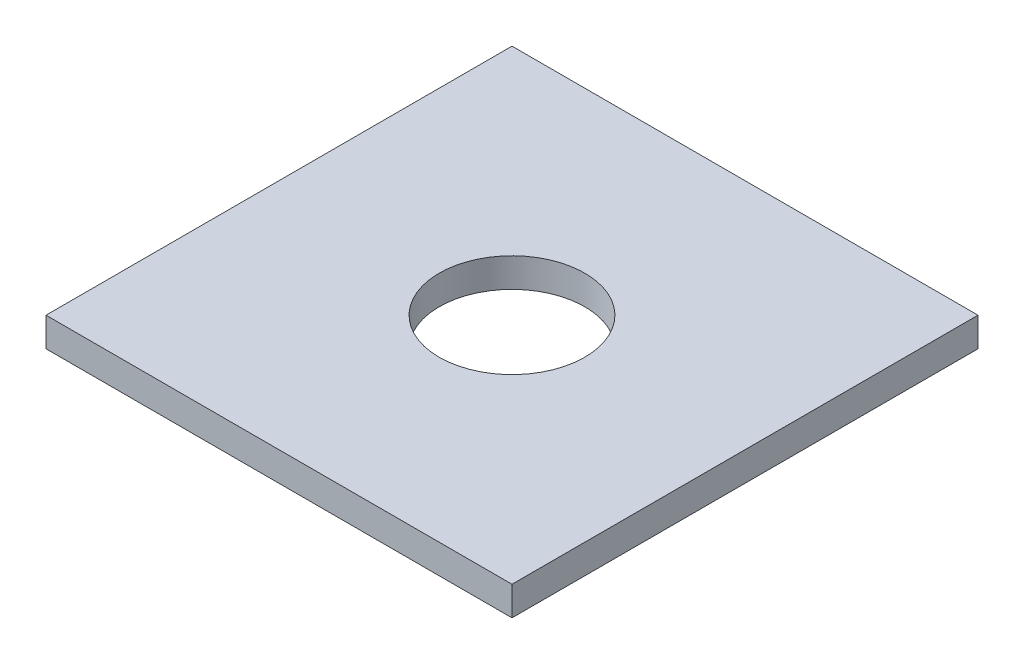
ISO-10303-21;
HEADER;
FILE_DESCRIPTION(('STEP AP214'),'2;1');
FILE_NAME('part.step','',(''),(''),'','','');
FILE_SCHEMA(('AUTOMOTIVE_DESIGN { 1 0 10303 214 1 1 1 1 }'));
ENDSEC;
DATA;
#1=APPLICATION_CONTEXT('core data for automotive mechanical design processes');
#2=APPLICATION_PROTOCOL_DEFINITION('international standard','automotive_design',2000,#1);
#3=PRODUCT_CONTEXT('',#1,'mechanical');
#4=PRODUCT('Part','Part','',(#3));
#5=PRODUCT_RELATED_PRODUCT_CATEGORY('part','',(#4));
#6=PRODUCT_DEFINITION_FORMATION('','',#4);
#7=PRODUCT_DEFINITION_CONTEXT('part definition',#1,'design');
#8=PRODUCT_DEFINITION('design','',#6,#7);
#9=PRODUCT_DEFINITION_SHAPE('','',#8);
#10=(LENGTH_UNIT() NAMED_UNIT(*) SI_UNIT(.MILLI.,.METRE.));
#11=(NAMED_UNIT(*) PLANE_ANGLE_UNIT() SI_UNIT($,.RADIAN.));
#12=(NAMED_UNIT(*) SI_UNIT($,.STERADIAN.) SOLID_ANGLE_UNIT());
#13=UNCERTAINTY_MEASURE_WITH_UNIT(LENGTH_MEASURE(1.E-05),#10,'distance_accuracy_value','');
#14=(GEOMETRIC_REPRESENTATION_CONTEXT(3) GLOBAL_UNCERTAINTY_ASSIGNED_CONTEXT((#13)) GLOBAL_UNIT_ASSIGNED_CONTEXT((#10,
#11,#12)) REPRESENTATION_CONTEXT('',''));
#15=CARTESIAN_POINT('',(0.,0.,0.));
#16=DIRECTION('',(0.,0.,1.));
#17=DIRECTION('',(1.,0.,0.));
#18=AXIS2_PLACEMENT_3D('',#15,#16,#17);
#19=CARTESIAN_POINT('',(8.,1.,-8.));
#20=DIRECTION('',(-1.,0.,0.));
#21=DIRECTION('',(0.,0.,1.));
#22=AXIS2_PLACEMENT_3D('',#19,#20,#21);
#23=PLANE('',#22);
#24=DIRECTION('',(0.,0.,-1.));
#25=VECTOR('',#24,1.);
#26=CARTESIAN_POINT('',(8.,0.,-8.));
#27=LINE('',#26,#25);
#28=CARTESIAN_POINT('',(8.,0.,8.));
#29=VERTEX_POINT('',#28);
#30=CARTESIAN_POINT('',(8.,0.,-8.));
#31=VERTEX_POINT('',#30);
#32=EDGE_CURVE('E98',#29,#31,#27,.T.);
#33=ORIENTED_EDGE('',*,*,#32,.T.);
#34=DIRECTION('',(0.,-1.,0.));
#35=VECTOR('',#34,1.);
#36=CARTESIAN_POINT('',(8.,1.,-8.));
#37=LINE('',#36,#35);
#38=CARTESIAN_POINT('',(8.,1.,-8.));
#39=VERTEX_POINT('',#38);
#40=EDGE_CURVE('E11',#39,#31,#37,.T.);
#41=ORIENTED_EDGE('',*,*,#40,.F.);
#42=DIRECTION('',(0.,0.,-1.));
#43=VECTOR('',#42,1.);
#44=CARTESIAN_POINT('',(8.,1.,-8.));
#45=LINE('',#44,#43);
#46=CARTESIAN_POINT('',(8.,1.,8.));
#47=VERTEX_POINT('',#46);
#48=EDGE_CURVE('E86',#47,#39,#45,.T.);
#49=ORIENTED_EDGE('',*,*,#48,.F.);
#50=DIRECTION('',(0.,-1.,0.));
#51=VECTOR('',#50,1.);
#52=CARTESIAN_POINT('',(8.,1.,8.));
#53=LINE('',#52,#51);
#54=EDGE_CURVE('E94',#47,#29,#53,.T.);
#55=ORIENTED_EDGE('',*,*,#54,.T.);
#56=EDGE_LOOP('',(#33,#41,#49,#55));
#57=FACE_BOUND('',#56,.T.);
#58=ADVANCED_FACE('F35',(#57),#23,.F.);
#59=CARTESIAN_POINT('',(-8.,1.,-8.));
#60=DIRECTION('',(0.,0.,1.));
#61=DIRECTION('',(1.,0.,0.));
#62=AXIS2_PLACEMENT_3D('',#59,#60,#61);
#63=PLANE('',#62);
#64=DIRECTION('',(-1.,0.,0.));
#65=VECTOR('',#64,1.);
#66=CARTESIAN_POINT('',(-8.,0.,-8.));
#67=LINE('',#66,#65);
#68=CARTESIAN_POINT('',(-8.,0.,-8.));
#69=VERTEX_POINT('',#68);
#70=EDGE_CURVE('E90',#31,#69,#67,.T.);
#71=ORIENTED_EDGE('',*,*,#70,.T.);
#72=DIRECTION('',(0.,-1.,0.));
#73=VECTOR('',#72,1.);
#74=CARTESIAN_POINT('',(-8.,1.,-8.));
#75=LINE('',#74,#73);
#76=CARTESIAN_POINT('',(-8.,1.,-8.));
#77=VERTEX_POINT('',#76);
#78=EDGE_CURVE('E43',#77,#69,#75,.T.);
#79=ORIENTED_EDGE('',*,*,#78,.F.);
#80=DIRECTION('',(-1.,0.,0.));
#81=VECTOR('',#80,1.);
#82=CARTESIAN_POINT('',(-8.,1.,-8.));
#83=LINE('',#82,#81);
#84=EDGE_CURVE('E81',#39,#77,#83,.T.);
#85=ORIENTED_EDGE('',*,*,#84,.F.);
#86=ORIENTED_EDGE('',*,*,#40,.T.);
#87=EDGE_LOOP('',(#71,#79,#85,#86));
#88=FACE_BOUND('',#87,.T.);
#89=ADVANCED_FACE('F89',(#88),#63,.F.);
#90=CARTESIAN_POINT('',(-8.,1.,-8.));
#91=DIRECTION('',(1.,0.,0.));
#92=DIRECTION('',(0.,0.,-1.));
#93=AXIS2_PLACEMENT_3D('',#90,#91,#92);
#94=PLANE('',#93);
#95=DIRECTION('',(0.,0.,1.));
#96=VECTOR('',#95,1.);
#97=CARTESIAN_POINT('',(-8.,0.,-8.));
#98=LINE('',#97,#96);
#99=CARTESIAN_POINT('',(-8.,0.,8.));
#100=VERTEX_POINT('',#99);
#101=EDGE_CURVE('E68',#69,#100,#98,.T.);
#102=ORIENTED_EDGE('',*,*,#101,.T.);
#103=DIRECTION('',(0.,-1.,0.));
#104=VECTOR('',#103,1.);
#105=CARTESIAN_POINT('',(-8.,1.,8.));
#106=LINE('',#105,#104);
#107=CARTESIAN_POINT('',(-8.,1.,8.));
#108=VERTEX_POINT('',#107);
#109=EDGE_CURVE('E91',#108,#100,#106,.T.);
#110=ORIENTED_EDGE('',*,*,#109,.F.);
#111=DIRECTION('',(0.,0.,1.));
#112=VECTOR('',#111,1.);
#113=CARTESIAN_POINT('',(-8.,1.,-8.));
#114=LINE('',#113,#112);
#115=EDGE_CURVE('E84',#77,#108,#114,.T.);
#116=ORIENTED_EDGE('',*,*,#115,.F.);
#117=ORIENTED_EDGE('',*,*,#78,.T.);
#118=EDGE_LOOP('',(#102,#110,#116,#117));
#119=FACE_BOUND('',#118,.T.);
#120=ADVANCED_FACE('F92',(#119),#94,.F.);
#121=CARTESIAN_POINT('',(-8.,1.,8.));
#122=DIRECTION('',(0.,0.,-1.));
#123=DIRECTION('',(-1.,0.,0.));
#124=AXIS2_PLACEMENT_3D('',#121,#122,#123);
#125=PLANE('',#124);
#126=DIRECTION('',(1.,0.,0.));
#127=VECTOR('',#126,1.);
#128=CARTESIAN_POINT('',(-8.,0.,8.));
#129=LINE('',#128,#127);
#130=EDGE_CURVE('E74',#100,#29,#129,.T.);
#131=ORIENTED_EDGE('',*,*,#130,.T.);
#132=ORIENTED_EDGE('',*,*,#54,.F.);
#133=DIRECTION('',(1.,0.,0.));
#134=VECTOR('',#133,1.);
#135=CARTESIAN_POINT('',(-8.,1.,8.));
#136=LINE('',#135,#134);
#137=EDGE_CURVE('E51',#108,#47,#136,.T.);
#138=ORIENTED_EDGE('',*,*,#137,.F.);
#139=ORIENTED_EDGE('',*,*,#109,.T.);
#140=EDGE_LOOP('',(#131,#132,#138,#139));
#141=FACE_BOUND('',#140,.T.);
#142=ADVANCED_FACE('F106',(#141),#125,.F.);
#143=CARTESIAN_POINT('',(8.,1.,8.));
#144=DIRECTION('',(0.,1.,0.));
#145=DIRECTION('',(0.,0.,1.));
#146=AXIS2_PLACEMENT_3D('',#143,#144,#145);
#147=PLANE('',#146);
#148=CARTESIAN_POINT('',(0.,1.,0.));
#149=DIRECTION('',(0.,1.,0.));
#150=DIRECTION('',(0.,0.,1.));
#151=AXIS2_PLACEMENT_3D('',#148,#149,#150);
#152=CIRCLE('',#151,2.5);
#153=CARTESIAN_POINT('',(0.,1.,2.5));
#154=VERTEX_POINT('',#153);
#155=EDGE_CURVE('E112',#154,#154,#152,.T.);
#156=ORIENTED_EDGE('',*,*,#155,.F.);
#157=EDGE_LOOP('',(#156));
#158=FACE_BOUND('',#157,.T.);
#159=ORIENTED_EDGE('',*,*,#48,.T.);
#160=ORIENTED_EDGE('',*,*,#84,.T.);
#161=ORIENTED_EDGE('',*,*,#115,.T.);
#162=ORIENTED_EDGE('',*,*,#137,.T.);
#163=EDGE_LOOP('',(#159,#160,#161,#162));
#164=FACE_BOUND('',#163,.T.);
#165=ADVANCED_FACE('F82',(#158,#164),#147,.T.);
#166=CARTESIAN_POINT('',(8.,0.,8.));
#167=DIRECTION('',(0.,1.,0.));
#168=DIRECTION('',(0.,0.,1.));
#169=AXIS2_PLACEMENT_3D('',#166,#167,#168);
#170=PLANE('',#169);
#171=CARTESIAN_POINT('',(0.,0.,0.));
#172=DIRECTION('',(0.,1.,0.));
#173=DIRECTION('',(0.,0.,1.));
#174=AXIS2_PLACEMENT_3D('',#171,#172,#173);
#175=CIRCLE('',#174,2.5);
#176=CARTESIAN_POINT('',(0.,0.,2.5));
#177=VERTEX_POINT('',#176);
#178=EDGE_CURVE('E101',#177,#177,#175,.T.);
#179=ORIENTED_EDGE('',*,*,#178,.T.);
#180=EDGE_LOOP('',(#179));
#181=FACE_BOUND('',#180,.T.);
#182=ORIENTED_EDGE('',*,*,#32,.F.);
#183=ORIENTED_EDGE('',*,*,#130,.F.);
#184=ORIENTED_EDGE('',*,*,#101,.F.);
#185=ORIENTED_EDGE('',*,*,#70,.F.);
#186=EDGE_LOOP('',(#182,#183,#184,#185));
#187=FACE_BOUND('',#186,.T.);
#188=ADVANCED_FACE('F109',(#181,#187),#170,.F.);
#189=CARTESIAN_POINT('',(0.,0.,0.));
#190=DIRECTION('',(0.,1.,0.));
#191=DIRECTION('',(0.,0.,1.));
#192=AXIS2_PLACEMENT_3D('',#189,#190,#191);
#193=CYLINDRICAL_SURFACE('',#192,2.5);
#194=ORIENTED_EDGE('',*,*,#178,.F.);
#195=EDGE_LOOP('',(#194));
#196=FACE_BOUND('',#195,.T.);
#197=ORIENTED_EDGE('',*,*,#155,.T.);
#198=EDGE_LOOP('',(#197));
#199=FACE_BOUND('',#198,.T.);
#200=ADVANCED_FACE('F119',(#196,#199),#193,.F.);
#201=CLOSED_SHELL('',(#58,#89,#120,#142,#165,#188,#200));
#202=MANIFOLD_SOLID_BREP('B2',#201);
#203=ADVANCED_BREP_SHAPE_REPRESENTATION('',(#18,#202),#14);
#204=SHAPE_DEFINITION_REPRESENTATION(#9,#203);
ENDSEC;
END-ISO-10303-21;
